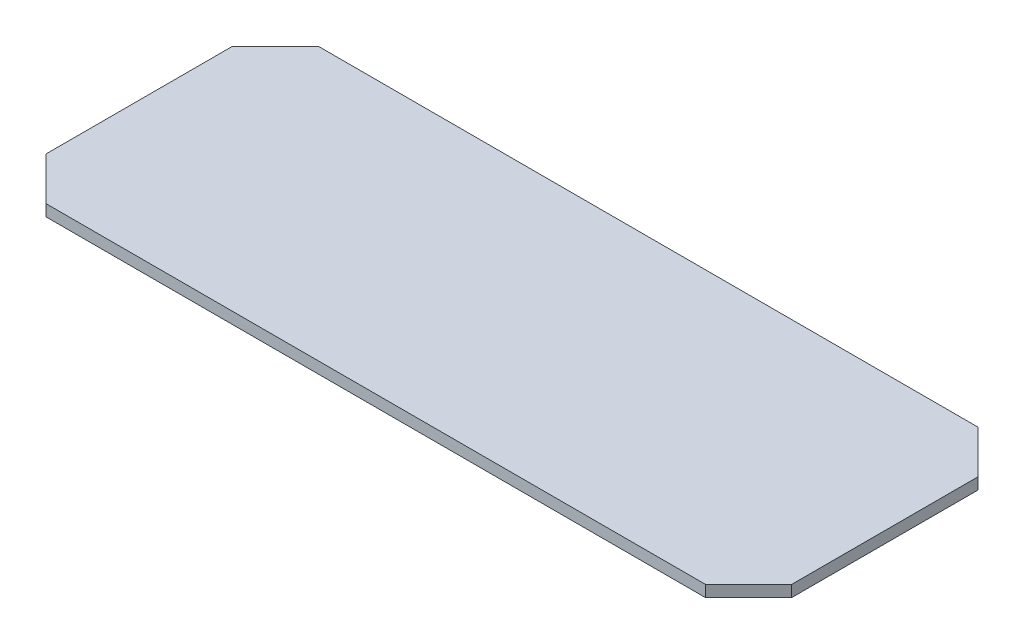
ISO-10303-21;
HEADER;
FILE_DESCRIPTION(('STEP AP214'),'2;1');
FILE_NAME('part.step','',(''),(''),'','','');
FILE_SCHEMA(('AUTOMOTIVE_DESIGN { 1 0 10303 214 1 1 1 1 }'));
ENDSEC;
DATA;
#1=APPLICATION_CONTEXT('core data for automotive mechanical design processes');
#2=APPLICATION_PROTOCOL_DEFINITION('international standard','automotive_design',2000,#1);
#3=PRODUCT_CONTEXT('',#1,'mechanical');
#4=PRODUCT('Part','Part','',(#3));
#5=PRODUCT_RELATED_PRODUCT_CATEGORY('part','',(#4));
#6=PRODUCT_DEFINITION_FORMATION('','',#4);
#7=PRODUCT_DEFINITION_CONTEXT('part definition',#1,'design');
#8=PRODUCT_DEFINITION('design','',#6,#7);
#9=PRODUCT_DEFINITION_SHAPE('','',#8);
#10=(LENGTH_UNIT() NAMED_UNIT(*) SI_UNIT(.MILLI.,.METRE.));
#11=(NAMED_UNIT(*) PLANE_ANGLE_UNIT() SI_UNIT($,.RADIAN.));
#12=(NAMED_UNIT(*) SI_UNIT($,.STERADIAN.) SOLID_ANGLE_UNIT());
#13=UNCERTAINTY_MEASURE_WITH_UNIT(LENGTH_MEASURE(1.E-05),#10,'distance_accuracy_value','');
#14=(GEOMETRIC_REPRESENTATION_CONTEXT(3) GLOBAL_UNCERTAINTY_ASSIGNED_CONTEXT((#13)) GLOBAL_UNIT_ASSIGNED_CONTEXT((#10,
#11,#12)) REPRESENTATION_CONTEXT('',''));
#15=CARTESIAN_POINT('',(0.,0.,0.));
#16=DIRECTION('',(0.,0.,1.));
#17=DIRECTION('',(1.,0.,0.));
#18=AXIS2_PLACEMENT_3D('',#15,#16,#17);
#19=CARTESIAN_POINT('',(-65.,2.,23.75));
#20=DIRECTION('',(1.,0.,0.));
#21=DIRECTION('',(0.,0.,-1.));
#22=AXIS2_PLACEMENT_3D('',#19,#20,#21);
#23=PLANE('',#22);
#24=DIRECTION('',(0.,0.,1.));
#25=VECTOR('',#24,1.);
#26=CARTESIAN_POINT('',(-65.,2.,23.75));
#27=LINE('',#26,#25);
#28=CARTESIAN_POINT('',(-65.,2.,-16.25));
#29=VERTEX_POINT('',#28);
#30=CARTESIAN_POINT('',(-65.,2.,16.25));
#31=VERTEX_POINT('',#30);
#32=EDGE_CURVE('E125',#29,#31,#27,.T.);
#33=ORIENTED_EDGE('',*,*,#32,.F.);
#34=DIRECTION('',(0.,-1.,0.));
#35=VECTOR('',#34,1.);
#36=CARTESIAN_POINT('',(-65.,2.,-16.25));
#37=LINE('',#36,#35);
#38=CARTESIAN_POINT('',(-65.,0.,-16.25));
#39=VERTEX_POINT('',#38);
#40=EDGE_CURVE('E109',#29,#39,#37,.T.);
#41=ORIENTED_EDGE('',*,*,#40,.T.);
#42=DIRECTION('',(0.,0.,1.));
#43=VECTOR('',#42,1.);
#44=CARTESIAN_POINT('',(-65.,0.,23.75));
#45=LINE('',#44,#43);
#46=CARTESIAN_POINT('',(-65.,0.,16.25));
#47=VERTEX_POINT('',#46);
#48=EDGE_CURVE('E122',#39,#47,#45,.T.);
#49=ORIENTED_EDGE('',*,*,#48,.T.);
#50=DIRECTION('',(0.,1.,0.));
#51=VECTOR('',#50,1.);
#52=CARTESIAN_POINT('',(-65.,2.,16.25));
#53=LINE('',#52,#51);
#54=EDGE_CURVE('E128',#47,#31,#53,.T.);
#55=ORIENTED_EDGE('',*,*,#54,.T.);
#56=EDGE_LOOP('',(#33,#41,#49,#55));
#57=FACE_BOUND('',#56,.T.);
#58=ADVANCED_FACE('F39',(#57),#23,.F.);
#59=CARTESIAN_POINT('',(65.,2.,23.75));
#60=DIRECTION('',(0.,0.,-1.));
#61=DIRECTION('',(-1.,0.,0.));
#62=AXIS2_PLACEMENT_3D('',#59,#60,#61);
#63=PLANE('',#62);
#64=DIRECTION('',(1.,0.,0.));
#65=VECTOR('',#64,1.);
#66=CARTESIAN_POINT('',(65.,2.,23.75));
#67=LINE('',#66,#65);
#68=CARTESIAN_POINT('',(-57.5,2.,23.75));
#69=VERTEX_POINT('',#68);
#70=CARTESIAN_POINT('',(57.5,2.,23.75));
#71=VERTEX_POINT('',#70);
#72=EDGE_CURVE('E196',#69,#71,#67,.T.);
#73=ORIENTED_EDGE('',*,*,#72,.F.);
#74=DIRECTION('',(0.,-1.,0.));
#75=VECTOR('',#74,1.);
#76=CARTESIAN_POINT('',(-57.5,2.,23.75));
#77=LINE('',#76,#75);
#78=CARTESIAN_POINT('',(-57.5,0.,23.75));
#79=VERTEX_POINT('',#78);
#80=EDGE_CURVE('E176',#69,#79,#77,.T.);
#81=ORIENTED_EDGE('',*,*,#80,.T.);
#82=DIRECTION('',(1.,0.,0.));
#83=VECTOR('',#82,1.);
#84=CARTESIAN_POINT('',(65.,0.,23.75));
#85=LINE('',#84,#83);
#86=CARTESIAN_POINT('',(57.5,0.,23.75));
#87=VERTEX_POINT('',#86);
#88=EDGE_CURVE('E133',#79,#87,#85,.T.);
#89=ORIENTED_EDGE('',*,*,#88,.T.);
#90=DIRECTION('',(0.,1.,0.));
#91=VECTOR('',#90,1.);
#92=CARTESIAN_POINT('',(57.5,2.,23.75));
#93=LINE('',#92,#91);
#94=EDGE_CURVE('E173',#87,#71,#93,.T.);
#95=ORIENTED_EDGE('',*,*,#94,.T.);
#96=EDGE_LOOP('',(#73,#81,#89,#95));
#97=FACE_BOUND('',#96,.T.);
#98=ADVANCED_FACE('F208',(#97),#63,.F.);
#99=CARTESIAN_POINT('',(65.,2.,23.75));
#100=DIRECTION('',(-1.,0.,0.));
#101=DIRECTION('',(0.,0.,1.));
#102=AXIS2_PLACEMENT_3D('',#99,#100,#101);
#103=PLANE('',#102);
#104=DIRECTION('',(0.,0.,-1.));
#105=VECTOR('',#104,1.);
#106=CARTESIAN_POINT('',(65.,0.,23.75));
#107=LINE('',#106,#105);
#108=CARTESIAN_POINT('',(65.,0.,16.25));
#109=VERTEX_POINT('',#108);
#110=CARTESIAN_POINT('',(65.,0.,-16.25));
#111=VERTEX_POINT('',#110);
#112=EDGE_CURVE('E137',#109,#111,#107,.T.);
#113=ORIENTED_EDGE('',*,*,#112,.T.);
#114=DIRECTION('',(0.,1.,0.));
#115=VECTOR('',#114,1.);
#116=CARTESIAN_POINT('',(65.,2.,-16.25));
#117=LINE('',#116,#115);
#118=CARTESIAN_POINT('',(65.,2.,-16.25));
#119=VERTEX_POINT('',#118);
#120=EDGE_CURVE('E11',#111,#119,#117,.T.);
#121=ORIENTED_EDGE('',*,*,#120,.T.);
#122=DIRECTION('',(0.,0.,-1.));
#123=VECTOR('',#122,1.);
#124=CARTESIAN_POINT('',(65.,2.,23.75));
#125=LINE('',#124,#123);
#126=CARTESIAN_POINT('',(65.,2.,16.25));
#127=VERTEX_POINT('',#126);
#128=EDGE_CURVE('E184',#127,#119,#125,.T.);
#129=ORIENTED_EDGE('',*,*,#128,.F.);
#130=DIRECTION('',(0.,-1.,0.));
#131=VECTOR('',#130,1.);
#132=CARTESIAN_POINT('',(65.,2.,16.25));
#133=LINE('',#132,#131);
#134=EDGE_CURVE('E48',#127,#109,#133,.T.);
#135=ORIENTED_EDGE('',*,*,#134,.T.);
#136=EDGE_LOOP('',(#113,#121,#129,#135));
#137=FACE_BOUND('',#136,.T.);
#138=ADVANCED_FACE('F183',(#137),#103,.F.);
#139=CARTESIAN_POINT('',(65.,2.,-23.75));
#140=DIRECTION('',(0.,0.,1.));
#141=DIRECTION('',(1.,0.,0.));
#142=AXIS2_PLACEMENT_3D('',#139,#140,#141);
#143=PLANE('',#142);
#144=DIRECTION('',(-1.,0.,0.));
#145=VECTOR('',#144,1.);
#146=CARTESIAN_POINT('',(65.,0.,-23.75));
#147=LINE('',#146,#145);
#148=CARTESIAN_POINT('',(57.5,0.,-23.75));
#149=VERTEX_POINT('',#148);
#150=CARTESIAN_POINT('',(-57.5,0.,-23.75));
#151=VERTEX_POINT('',#150);
#152=EDGE_CURVE('E145',#149,#151,#147,.T.);
#153=ORIENTED_EDGE('',*,*,#152,.T.);
#154=DIRECTION('',(0.,1.,0.));
#155=VECTOR('',#154,1.);
#156=CARTESIAN_POINT('',(-57.5,2.,-23.75));
#157=LINE('',#156,#155);
#158=CARTESIAN_POINT('',(-57.5,2.,-23.75));
#159=VERTEX_POINT('',#158);
#160=EDGE_CURVE('E110',#151,#159,#157,.T.);
#161=ORIENTED_EDGE('',*,*,#160,.T.);
#162=DIRECTION('',(-1.,0.,0.));
#163=VECTOR('',#162,1.);
#164=CARTESIAN_POINT('',(65.,2.,-23.75));
#165=LINE('',#164,#163);
#166=CARTESIAN_POINT('',(57.5,2.,-23.75));
#167=VERTEX_POINT('',#166);
#168=EDGE_CURVE('E140',#167,#159,#165,.T.);
#169=ORIENTED_EDGE('',*,*,#168,.F.);
#170=DIRECTION('',(0.,-1.,0.));
#171=VECTOR('',#170,1.);
#172=CARTESIAN_POINT('',(57.5,2.,-23.75));
#173=LINE('',#172,#171);
#174=EDGE_CURVE('E116',#167,#149,#173,.T.);
#175=ORIENTED_EDGE('',*,*,#174,.T.);
#176=EDGE_LOOP('',(#153,#161,#169,#175));
#177=FACE_BOUND('',#176,.T.);
#178=ADVANCED_FACE('F192',(#177),#143,.F.);
#179=CARTESIAN_POINT('',(0.,2.,0.));
#180=DIRECTION('',(0.,1.,0.));
#181=DIRECTION('',(0.,0.,1.));
#182=AXIS2_PLACEMENT_3D('',#179,#180,#181);
#183=PLANE('',#182);
#184=ORIENTED_EDGE('',*,*,#168,.T.);
#185=DIRECTION('',(0.707106781186549,0.,-0.707106781186546));
#186=VECTOR('',#185,1.);
#187=CARTESIAN_POINT('',(-40.6249999999999,2.,-40.625));
#188=LINE('',#187,#186);
#189=EDGE_CURVE('E170',#159,#29,#188,.F.);
#190=ORIENTED_EDGE('',*,*,#189,.T.);
#191=ORIENTED_EDGE('',*,*,#32,.T.);
#192=DIRECTION('',(-0.707106781186546,0.,-0.707106781186549));
#193=VECTOR('',#192,1.);
#194=CARTESIAN_POINT('',(-40.6250000000001,2.,40.625));
#195=LINE('',#194,#193);
#196=EDGE_CURVE('E167',#31,#69,#195,.F.);
#197=ORIENTED_EDGE('',*,*,#196,.T.);
#198=ORIENTED_EDGE('',*,*,#72,.T.);
#199=DIRECTION('',(-0.707106781186549,0.,0.707106781186547));
#200=VECTOR('',#199,1.);
#201=CARTESIAN_POINT('',(40.6249999999999,2.,40.625));
#202=LINE('',#201,#200);
#203=EDGE_CURVE('E60',#71,#127,#202,.F.);
#204=ORIENTED_EDGE('',*,*,#203,.T.);
#205=ORIENTED_EDGE('',*,*,#128,.T.);
#206=DIRECTION('',(0.707106781186546,0.,0.707106781186549));
#207=VECTOR('',#206,1.);
#208=CARTESIAN_POINT('',(40.6250000000001,2.,-40.6249999999999));
#209=LINE('',#208,#207);
#210=EDGE_CURVE('E164',#119,#167,#209,.F.);
#211=ORIENTED_EDGE('',*,*,#210,.T.);
#212=EDGE_LOOP('',(#184,#190,#191,#197,#198,#204,#205,#211));
#213=FACE_BOUND('',#212,.T.);
#214=ADVANCED_FACE('F202',(#213),#183,.T.);
#215=CARTESIAN_POINT('',(0.,0.,0.));
#216=DIRECTION('',(0.,1.,0.));
#217=DIRECTION('',(0.,0.,1.));
#218=AXIS2_PLACEMENT_3D('',#215,#216,#217);
#219=PLANE('',#218);
#220=ORIENTED_EDGE('',*,*,#48,.F.);
#221=DIRECTION('',(-0.707106781186549,0.,0.707106781186546));
#222=VECTOR('',#221,1.);
#223=CARTESIAN_POINT('',(-65.,0.,-16.25));
#224=LINE('',#223,#222);
#225=EDGE_CURVE('E105',#39,#151,#224,.F.);
#226=ORIENTED_EDGE('',*,*,#225,.T.);
#227=ORIENTED_EDGE('',*,*,#152,.F.);
#228=DIRECTION('',(-0.707106781186546,0.,-0.707106781186549));
#229=VECTOR('',#228,1.);
#230=CARTESIAN_POINT('',(57.5,0.,-23.75));
#231=LINE('',#230,#229);
#232=EDGE_CURVE('E152',#149,#111,#231,.F.);
#233=ORIENTED_EDGE('',*,*,#232,.T.);
#234=ORIENTED_EDGE('',*,*,#112,.F.);
#235=DIRECTION('',(0.707106781186549,0.,-0.707106781186547));
#236=VECTOR('',#235,1.);
#237=CARTESIAN_POINT('',(65.,0.,16.25));
#238=LINE('',#237,#236);
#239=EDGE_CURVE('E127',#109,#87,#238,.F.);
#240=ORIENTED_EDGE('',*,*,#239,.T.);
#241=ORIENTED_EDGE('',*,*,#88,.F.);
#242=DIRECTION('',(0.707106781186546,0.,0.707106781186549));
#243=VECTOR('',#242,1.);
#244=CARTESIAN_POINT('',(-57.5,0.,23.75));
#245=LINE('',#244,#243);
#246=EDGE_CURVE('E117',#79,#47,#245,.F.);
#247=ORIENTED_EDGE('',*,*,#246,.T.);
#248=EDGE_LOOP('',(#220,#226,#227,#233,#234,#240,#241,#247));
#249=FACE_BOUND('',#248,.T.);
#250=ADVANCED_FACE('F130',(#249),#219,.F.);
#251=CARTESIAN_POINT('',(-65.,2.,-16.25));
#252=DIRECTION('',(0.707106781186546,0.,0.707106781186549));
#253=DIRECTION('',(0.,-1.,0.));
#254=AXIS2_PLACEMENT_3D('',#251,#252,#253);
#255=PLANE('',#254);
#256=ORIENTED_EDGE('',*,*,#189,.F.);
#257=ORIENTED_EDGE('',*,*,#160,.F.);
#258=ORIENTED_EDGE('',*,*,#225,.F.);
#259=ORIENTED_EDGE('',*,*,#40,.F.);
#260=EDGE_LOOP('',(#256,#257,#258,#259));
#261=FACE_BOUND('',#260,.T.);
#262=ADVANCED_FACE('F108',(#261),#255,.F.);
#263=CARTESIAN_POINT('',(-57.5,2.,23.75));
#264=DIRECTION('',(0.707106781186549,0.,-0.707106781186546));
#265=DIRECTION('',(0.,-1.,0.));
#266=AXIS2_PLACEMENT_3D('',#263,#264,#265);
#267=PLANE('',#266);
#268=ORIENTED_EDGE('',*,*,#196,.F.);
#269=ORIENTED_EDGE('',*,*,#54,.F.);
#270=ORIENTED_EDGE('',*,*,#246,.F.);
#271=ORIENTED_EDGE('',*,*,#80,.F.);
#272=EDGE_LOOP('',(#268,#269,#270,#271));
#273=FACE_BOUND('',#272,.T.);
#274=ADVANCED_FACE('F206',(#273),#267,.F.);
#275=CARTESIAN_POINT('',(57.5,2.,-23.75));
#276=DIRECTION('',(-0.707106781186549,0.,0.707106781186546));
#277=DIRECTION('',(0.,-1.,0.));
#278=AXIS2_PLACEMENT_3D('',#275,#276,#277);
#279=PLANE('',#278);
#280=ORIENTED_EDGE('',*,*,#210,.F.);
#281=ORIENTED_EDGE('',*,*,#120,.F.);
#282=ORIENTED_EDGE('',*,*,#232,.F.);
#283=ORIENTED_EDGE('',*,*,#174,.F.);
#284=EDGE_LOOP('',(#280,#281,#282,#283));
#285=FACE_BOUND('',#284,.T.);
#286=ADVANCED_FACE('F189',(#285),#279,.F.);
#287=CARTESIAN_POINT('',(65.,2.,16.25));
#288=DIRECTION('',(-0.707106781186546,0.,-0.707106781186548));
#289=DIRECTION('',(0.,-1.,0.));
#290=AXIS2_PLACEMENT_3D('',#287,#288,#289);
#291=PLANE('',#290);
#292=ORIENTED_EDGE('',*,*,#203,.F.);
#293=ORIENTED_EDGE('',*,*,#94,.F.);
#294=ORIENTED_EDGE('',*,*,#239,.F.);
#295=ORIENTED_EDGE('',*,*,#134,.F.);
#296=EDGE_LOOP('',(#292,#293,#294,#295));
#297=FACE_BOUND('',#296,.T.);
#298=ADVANCED_FACE('F41',(#297),#291,.F.);
#299=CLOSED_SHELL('',(#58,#98,#138,#178,#214,#250,#262,#274,#286,#298));
#300=MANIFOLD_SOLID_BREP('B2',#299);
#301=ADVANCED_BREP_SHAPE_REPRESENTATION('',(#18,#300),#14);
#302=SHAPE_DEFINITION_REPRESENTATION(#9,#301);
ENDSEC;
END-ISO-10303-21;
